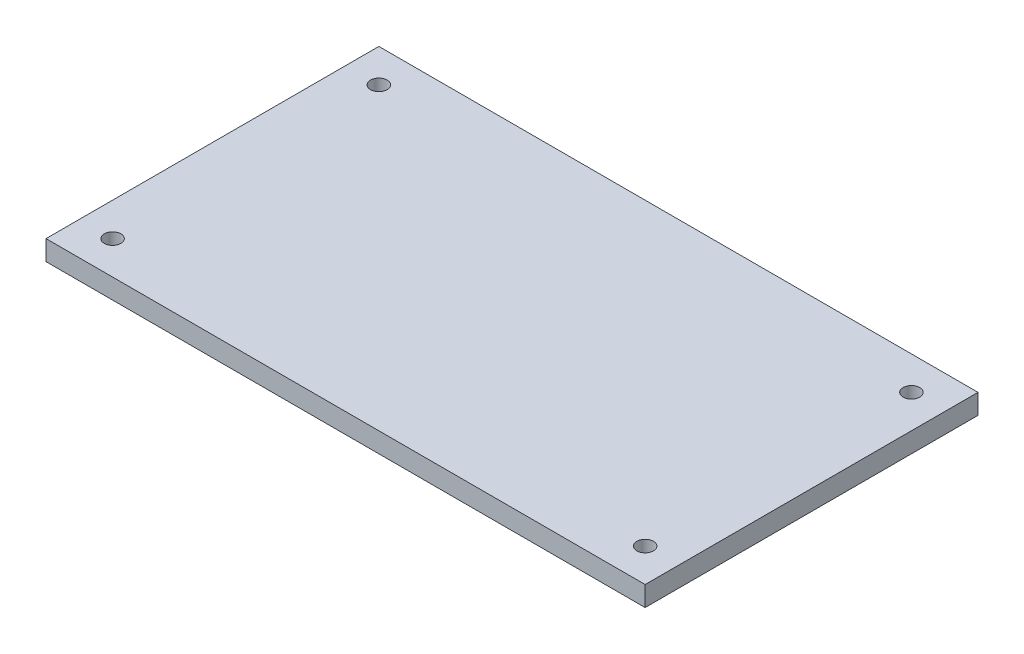
ISO-10303-21;
HEADER;
FILE_DESCRIPTION(('STEP AP214'),'2;1');
FILE_NAME('part.step','',(''),(''),'','','');
FILE_SCHEMA(('AUTOMOTIVE_DESIGN { 1 0 10303 214 1 1 1 1 }'));
ENDSEC;
DATA;
#1=APPLICATION_CONTEXT('core data for automotive mechanical design processes');
#2=APPLICATION_PROTOCOL_DEFINITION('international standard','automotive_design',2000,#1);
#3=PRODUCT_CONTEXT('',#1,'mechanical');
#4=PRODUCT('Part','Part','',(#3));
#5=PRODUCT_RELATED_PRODUCT_CATEGORY('part','',(#4));
#6=PRODUCT_DEFINITION_FORMATION('','',#4);
#7=PRODUCT_DEFINITION_CONTEXT('part definition',#1,'design');
#8=PRODUCT_DEFINITION('design','',#6,#7);
#9=PRODUCT_DEFINITION_SHAPE('','',#8);
#10=(LENGTH_UNIT() NAMED_UNIT(*) SI_UNIT(.MILLI.,.METRE.));
#11=(NAMED_UNIT(*) PLANE_ANGLE_UNIT() SI_UNIT($,.RADIAN.));
#12=(NAMED_UNIT(*) SI_UNIT($,.STERADIAN.) SOLID_ANGLE_UNIT());
#13=UNCERTAINTY_MEASURE_WITH_UNIT(LENGTH_MEASURE(1.E-05),#10,'distance_accuracy_value','');
#14=(GEOMETRIC_REPRESENTATION_CONTEXT(3) GLOBAL_UNCERTAINTY_ASSIGNED_CONTEXT((#13)) GLOBAL_UNIT_ASSIGNED_CONTEXT((#10,
#11,#12)) REPRESENTATION_CONTEXT('',''));
#15=CARTESIAN_POINT('',(0.,0.,0.));
#16=DIRECTION('',(0.,0.,1.));
#17=DIRECTION('',(1.,0.,0.));
#18=AXIS2_PLACEMENT_3D('',#15,#16,#17);
#19=CARTESIAN_POINT('',(-11.1206896551724,3.,-30.2801724137931));
#20=DIRECTION('',(1.,0.,0.));
#21=DIRECTION('',(0.,0.,-1.));
#22=AXIS2_PLACEMENT_3D('',#19,#20,#21);
#23=PLANE('',#22);
#24=DIRECTION('',(0.,0.,1.));
#25=VECTOR('',#24,1.);
#26=CARTESIAN_POINT('',(-11.1206896551724,0.,-30.2801724137931));
#27=LINE('',#26,#25);
#28=CARTESIAN_POINT('',(-11.1206896551724,0.,-30.2801724137931));
#29=VERTEX_POINT('',#28);
#30=CARTESIAN_POINT('',(-11.1206896551724,0.,19.7198275862069));
#31=VERTEX_POINT('',#30);
#32=EDGE_CURVE('E104',#29,#31,#27,.T.);
#33=ORIENTED_EDGE('',*,*,#32,.T.);
#34=DIRECTION('',(0.,-1.,0.));
#35=VECTOR('',#34,1.);
#36=CARTESIAN_POINT('',(-11.1206896551724,3.,19.7198275862069));
#37=LINE('',#36,#35);
#38=CARTESIAN_POINT('',(-11.1206896551724,3.,19.7198275862069));
#39=VERTEX_POINT('',#38);
#40=EDGE_CURVE('E11',#39,#31,#37,.T.);
#41=ORIENTED_EDGE('',*,*,#40,.F.);
#42=DIRECTION('',(0.,0.,1.));
#43=VECTOR('',#42,1.);
#44=CARTESIAN_POINT('',(-11.1206896551724,3.,-30.2801724137931));
#45=LINE('',#44,#43);
#46=CARTESIAN_POINT('',(-11.1206896551724,3.,-30.2801724137931));
#47=VERTEX_POINT('',#46);
#48=EDGE_CURVE('E94',#47,#39,#45,.T.);
#49=ORIENTED_EDGE('',*,*,#48,.F.);
#50=DIRECTION('',(0.,-1.,0.));
#51=VECTOR('',#50,1.);
#52=CARTESIAN_POINT('',(-11.1206896551724,3.,-30.2801724137931));
#53=LINE('',#52,#51);
#54=EDGE_CURVE('E99',#47,#29,#53,.T.);
#55=ORIENTED_EDGE('',*,*,#54,.T.);
#56=EDGE_LOOP('',(#33,#41,#49,#55));
#57=FACE_BOUND('',#56,.T.);
#58=ADVANCED_FACE('F41',(#57),#23,.F.);
#59=CARTESIAN_POINT('',(-11.1206896551724,3.,19.7198275862069));
#60=DIRECTION('',(0.,0.,-1.));
#61=DIRECTION('',(-1.,0.,0.));
#62=AXIS2_PLACEMENT_3D('',#59,#60,#61);
#63=PLANE('',#62);
#64=DIRECTION('',(1.,0.,0.));
#65=VECTOR('',#64,1.);
#66=CARTESIAN_POINT('',(-11.1206896551724,0.,19.7198275862069));
#67=LINE('',#66,#65);
#68=CARTESIAN_POINT('',(78.8793103448276,0.,19.7198275862069));
#69=VERTEX_POINT('',#68);
#70=EDGE_CURVE('E98',#31,#69,#67,.T.);
#71=ORIENTED_EDGE('',*,*,#70,.T.);
#72=DIRECTION('',(0.,-1.,0.));
#73=VECTOR('',#72,1.);
#74=CARTESIAN_POINT('',(78.8793103448276,3.,19.7198275862069));
#75=LINE('',#74,#73);
#76=CARTESIAN_POINT('',(78.8793103448276,3.,19.7198275862069));
#77=VERTEX_POINT('',#76);
#78=EDGE_CURVE('E47',#77,#69,#75,.T.);
#79=ORIENTED_EDGE('',*,*,#78,.F.);
#80=DIRECTION('',(1.,0.,0.));
#81=VECTOR('',#80,1.);
#82=CARTESIAN_POINT('',(-11.1206896551724,3.,19.7198275862069));
#83=LINE('',#82,#81);
#84=EDGE_CURVE('E86',#39,#77,#83,.T.);
#85=ORIENTED_EDGE('',*,*,#84,.F.);
#86=ORIENTED_EDGE('',*,*,#40,.T.);
#87=EDGE_LOOP('',(#71,#79,#85,#86));
#88=FACE_BOUND('',#87,.T.);
#89=ADVANCED_FACE('F93',(#88),#63,.F.);
#90=CARTESIAN_POINT('',(78.8793103448276,3.,-30.2801724137931));
#91=DIRECTION('',(-1.,0.,0.));
#92=DIRECTION('',(0.,0.,1.));
#93=AXIS2_PLACEMENT_3D('',#90,#91,#92);
#94=PLANE('',#93);
#95=DIRECTION('',(0.,0.,-1.));
#96=VECTOR('',#95,1.);
#97=CARTESIAN_POINT('',(78.8793103448276,0.,-30.2801724137931));
#98=LINE('',#97,#96);
#99=CARTESIAN_POINT('',(78.8793103448276,0.,-30.2801724137931));
#100=VERTEX_POINT('',#99);
#101=EDGE_CURVE('E71',#69,#100,#98,.T.);
#102=ORIENTED_EDGE('',*,*,#101,.T.);
#103=DIRECTION('',(0.,-1.,0.));
#104=VECTOR('',#103,1.);
#105=CARTESIAN_POINT('',(78.8793103448276,3.,-30.2801724137931));
#106=LINE('',#105,#104);
#107=CARTESIAN_POINT('',(78.8793103448276,3.,-30.2801724137931));
#108=VERTEX_POINT('',#107);
#109=EDGE_CURVE('E97',#108,#100,#106,.T.);
#110=ORIENTED_EDGE('',*,*,#109,.F.);
#111=DIRECTION('',(0.,0.,-1.));
#112=VECTOR('',#111,1.);
#113=CARTESIAN_POINT('',(78.8793103448276,3.,-30.2801724137931));
#114=LINE('',#113,#112);
#115=EDGE_CURVE('E87',#77,#108,#114,.T.);
#116=ORIENTED_EDGE('',*,*,#115,.F.);
#117=ORIENTED_EDGE('',*,*,#78,.T.);
#118=EDGE_LOOP('',(#102,#110,#116,#117));
#119=FACE_BOUND('',#118,.T.);
#120=ADVANCED_FACE('F96',(#119),#94,.F.);
#121=CARTESIAN_POINT('',(-11.1206896551724,3.,-30.2801724137931));
#122=DIRECTION('',(0.,0.,1.));
#123=DIRECTION('',(1.,0.,0.));
#124=AXIS2_PLACEMENT_3D('',#121,#122,#123);
#125=PLANE('',#124);
#126=DIRECTION('',(-1.,0.,0.));
#127=VECTOR('',#126,1.);
#128=CARTESIAN_POINT('',(-11.1206896551724,0.,-30.2801724137931));
#129=LINE('',#128,#127);
#130=EDGE_CURVE('E78',#100,#29,#129,.T.);
#131=ORIENTED_EDGE('',*,*,#130,.T.);
#132=ORIENTED_EDGE('',*,*,#54,.F.);
#133=DIRECTION('',(-1.,0.,0.));
#134=VECTOR('',#133,1.);
#135=CARTESIAN_POINT('',(-11.1206896551724,3.,-30.2801724137931));
#136=LINE('',#135,#134);
#137=EDGE_CURVE('E60',#108,#47,#136,.T.);
#138=ORIENTED_EDGE('',*,*,#137,.F.);
#139=ORIENTED_EDGE('',*,*,#109,.T.);
#140=EDGE_LOOP('',(#131,#132,#138,#139));
#141=FACE_BOUND('',#140,.T.);
#142=ADVANCED_FACE('F115',(#141),#125,.F.);
#143=CARTESIAN_POINT('',(0.,3.,0.));
#144=DIRECTION('',(0.,1.,0.));
#145=DIRECTION('',(0.,0.,1.));
#146=AXIS2_PLACEMENT_3D('',#143,#144,#145);
#147=PLANE('',#146);
#148=CARTESIAN_POINT('',(-6.12068965517241,3.,14.7198275862069));
#149=DIRECTION('',(0.,1.,0.));
#150=DIRECTION('',(0.,0.,1.));
#151=AXIS2_PLACEMENT_3D('',#148,#149,#150);
#152=CIRCLE('',#151,1.25);
#153=CARTESIAN_POINT('',(-6.12068965517241,3.,15.9698275862069));
#154=VERTEX_POINT('',#153);
#155=EDGE_CURVE('E130',#154,#154,#152,.T.);
#156=ORIENTED_EDGE('',*,*,#155,.F.);
#157=EDGE_LOOP('',(#156));
#158=FACE_BOUND('',#157,.T.);
#159=CARTESIAN_POINT('',(73.8793103448276,3.,14.7198275862069));
#160=DIRECTION('',(0.,1.,0.));
#161=DIRECTION('',(0.,0.,1.));
#162=AXIS2_PLACEMENT_3D('',#159,#160,#161);
#163=CIRCLE('',#162,1.25);
#164=CARTESIAN_POINT('',(73.8793103448276,3.,15.9698275862069));
#165=VERTEX_POINT('',#164);
#166=EDGE_CURVE('E135',#165,#165,#163,.T.);
#167=ORIENTED_EDGE('',*,*,#166,.F.);
#168=EDGE_LOOP('',(#167));
#169=FACE_BOUND('',#168,.T.);
#170=CARTESIAN_POINT('',(73.8793103448276,3.,-25.2801724137931));
#171=DIRECTION('',(0.,1.,0.));
#172=DIRECTION('',(0.,0.,1.));
#173=AXIS2_PLACEMENT_3D('',#170,#171,#172);
#174=CIRCLE('',#173,1.25);
#175=CARTESIAN_POINT('',(73.8793103448276,3.,-24.0301724137931));
#176=VERTEX_POINT('',#175);
#177=EDGE_CURVE('E122',#176,#176,#174,.T.);
#178=ORIENTED_EDGE('',*,*,#177,.F.);
#179=EDGE_LOOP('',(#178));
#180=FACE_BOUND('',#179,.T.);
#181=CARTESIAN_POINT('',(-6.12068965517241,3.,-25.2801724137931));
#182=DIRECTION('',(0.,1.,0.));
#183=DIRECTION('',(0.,0.,1.));
#184=AXIS2_PLACEMENT_3D('',#181,#182,#183);
#185=CIRCLE('',#184,1.25);
#186=CARTESIAN_POINT('',(-6.12068965517241,3.,-24.0301724137931));
#187=VERTEX_POINT('',#186);
#188=EDGE_CURVE('E117',#187,#187,#185,.T.);
#189=ORIENTED_EDGE('',*,*,#188,.F.);
#190=EDGE_LOOP('',(#189));
#191=FACE_BOUND('',#190,.T.);
#192=ORIENTED_EDGE('',*,*,#48,.T.);
#193=ORIENTED_EDGE('',*,*,#84,.T.);
#194=ORIENTED_EDGE('',*,*,#115,.T.);
#195=ORIENTED_EDGE('',*,*,#137,.T.);
#196=EDGE_LOOP('',(#192,#193,#194,#195));
#197=FACE_BOUND('',#196,.T.);
#198=ADVANCED_FACE('F90',(#158,#169,#180,#191,#197),#147,.T.);
#199=CARTESIAN_POINT('',(0.,0.,0.));
#200=DIRECTION('',(0.,1.,0.));
#201=DIRECTION('',(0.,0.,1.));
#202=AXIS2_PLACEMENT_3D('',#199,#200,#201);
#203=PLANE('',#202);
#204=CARTESIAN_POINT('',(-6.12068965517241,0.,14.7198275862069));
#205=DIRECTION('',(0.,1.,0.));
#206=DIRECTION('',(0.,0.,1.));
#207=AXIS2_PLACEMENT_3D('',#204,#205,#206);
#208=CIRCLE('',#207,1.25);
#209=CARTESIAN_POINT('',(-6.12068965517241,0.,15.9698275862069));
#210=VERTEX_POINT('',#209);
#211=EDGE_CURVE('E121',#210,#210,#208,.T.);
#212=ORIENTED_EDGE('',*,*,#211,.T.);
#213=EDGE_LOOP('',(#212));
#214=FACE_BOUND('',#213,.T.);
#215=CARTESIAN_POINT('',(73.8793103448276,0.,14.7198275862069));
#216=DIRECTION('',(0.,1.,0.));
#217=DIRECTION('',(0.,0.,1.));
#218=AXIS2_PLACEMENT_3D('',#215,#216,#217);
#219=CIRCLE('',#218,1.25);
#220=CARTESIAN_POINT('',(73.8793103448276,0.,15.9698275862069));
#221=VERTEX_POINT('',#220);
#222=EDGE_CURVE('E128',#221,#221,#219,.T.);
#223=ORIENTED_EDGE('',*,*,#222,.T.);
#224=EDGE_LOOP('',(#223));
#225=FACE_BOUND('',#224,.T.);
#226=CARTESIAN_POINT('',(73.8793103448276,0.,-25.2801724137931));
#227=DIRECTION('',(0.,1.,0.));
#228=DIRECTION('',(0.,0.,1.));
#229=AXIS2_PLACEMENT_3D('',#226,#227,#228);
#230=CIRCLE('',#229,1.25);
#231=CARTESIAN_POINT('',(73.8793103448276,0.,-24.0301724137931));
#232=VERTEX_POINT('',#231);
#233=EDGE_CURVE('E137',#232,#232,#230,.T.);
#234=ORIENTED_EDGE('',*,*,#233,.T.);
#235=EDGE_LOOP('',(#234));
#236=FACE_BOUND('',#235,.T.);
#237=CARTESIAN_POINT('',(-6.12068965517241,0.,-25.2801724137931));
#238=DIRECTION('',(0.,1.,0.));
#239=DIRECTION('',(0.,0.,1.));
#240=AXIS2_PLACEMENT_3D('',#237,#238,#239);
#241=CIRCLE('',#240,1.25);
#242=CARTESIAN_POINT('',(-6.12068965517241,0.,-24.0301724137931));
#243=VERTEX_POINT('',#242);
#244=EDGE_CURVE('E110',#243,#243,#241,.T.);
#245=ORIENTED_EDGE('',*,*,#244,.T.);
#246=EDGE_LOOP('',(#245));
#247=FACE_BOUND('',#246,.T.);
#248=ORIENTED_EDGE('',*,*,#32,.F.);
#249=ORIENTED_EDGE('',*,*,#130,.F.);
#250=ORIENTED_EDGE('',*,*,#101,.F.);
#251=ORIENTED_EDGE('',*,*,#70,.F.);
#252=EDGE_LOOP('',(#248,#249,#250,#251));
#253=FACE_BOUND('',#252,.T.);
#254=ADVANCED_FACE('F114',(#214,#225,#236,#247,#253),#203,.F.);
#255=CARTESIAN_POINT('',(-6.12068965517241,0.,-25.2801724137931));
#256=DIRECTION('',(0.,1.,0.));
#257=DIRECTION('',(0.,0.,1.));
#258=AXIS2_PLACEMENT_3D('',#255,#256,#257);
#259=CYLINDRICAL_SURFACE('',#258,1.25);
#260=ORIENTED_EDGE('',*,*,#244,.F.);
#261=EDGE_LOOP('',(#260));
#262=FACE_BOUND('',#261,.T.);
#263=ORIENTED_EDGE('',*,*,#188,.T.);
#264=EDGE_LOOP('',(#263));
#265=FACE_BOUND('',#264,.T.);
#266=ADVANCED_FACE('F148',(#262,#265),#259,.F.);
#267=CARTESIAN_POINT('',(73.8793103448276,0.,-25.2801724137931));
#268=DIRECTION('',(0.,1.,0.));
#269=DIRECTION('',(0.,0.,1.));
#270=AXIS2_PLACEMENT_3D('',#267,#268,#269);
#271=CYLINDRICAL_SURFACE('',#270,1.25);
#272=ORIENTED_EDGE('',*,*,#233,.F.);
#273=EDGE_LOOP('',(#272));
#274=FACE_BOUND('',#273,.T.);
#275=ORIENTED_EDGE('',*,*,#177,.T.);
#276=EDGE_LOOP('',(#275));
#277=FACE_BOUND('',#276,.T.);
#278=ADVANCED_FACE('F145',(#274,#277),#271,.F.);
#279=CARTESIAN_POINT('',(73.8793103448276,0.,14.7198275862069));
#280=DIRECTION('',(0.,1.,0.));
#281=DIRECTION('',(0.,0.,1.));
#282=AXIS2_PLACEMENT_3D('',#279,#280,#281);
#283=CYLINDRICAL_SURFACE('',#282,1.25);
#284=ORIENTED_EDGE('',*,*,#222,.F.);
#285=EDGE_LOOP('',(#284));
#286=FACE_BOUND('',#285,.T.);
#287=ORIENTED_EDGE('',*,*,#166,.T.);
#288=EDGE_LOOP('',(#287));
#289=FACE_BOUND('',#288,.T.);
#290=ADVANCED_FACE('F160',(#286,#289),#283,.F.);
#291=CARTESIAN_POINT('',(-6.12068965517241,0.,14.7198275862069));
#292=DIRECTION('',(0.,1.,0.));
#293=DIRECTION('',(0.,0.,1.));
#294=AXIS2_PLACEMENT_3D('',#291,#292,#293);
#295=CYLINDRICAL_SURFACE('',#294,1.25);
#296=ORIENTED_EDGE('',*,*,#211,.F.);
#297=EDGE_LOOP('',(#296));
#298=FACE_BOUND('',#297,.T.);
#299=ORIENTED_EDGE('',*,*,#155,.T.);
#300=EDGE_LOOP('',(#299));
#301=FACE_BOUND('',#300,.T.);
#302=ADVANCED_FACE('F209',(#298,#301),#295,.F.);
#303=CLOSED_SHELL('',(#58,#89,#120,#142,#198,#254,#266,#278,#290,#302));
#304=MANIFOLD_SOLID_BREP('B2',#303);
#305=ADVANCED_BREP_SHAPE_REPRESENTATION('',(#18,#304),#14);
#306=SHAPE_DEFINITION_REPRESENTATION(#9,#305);
ENDSEC;
END-ISO-10303-21;
